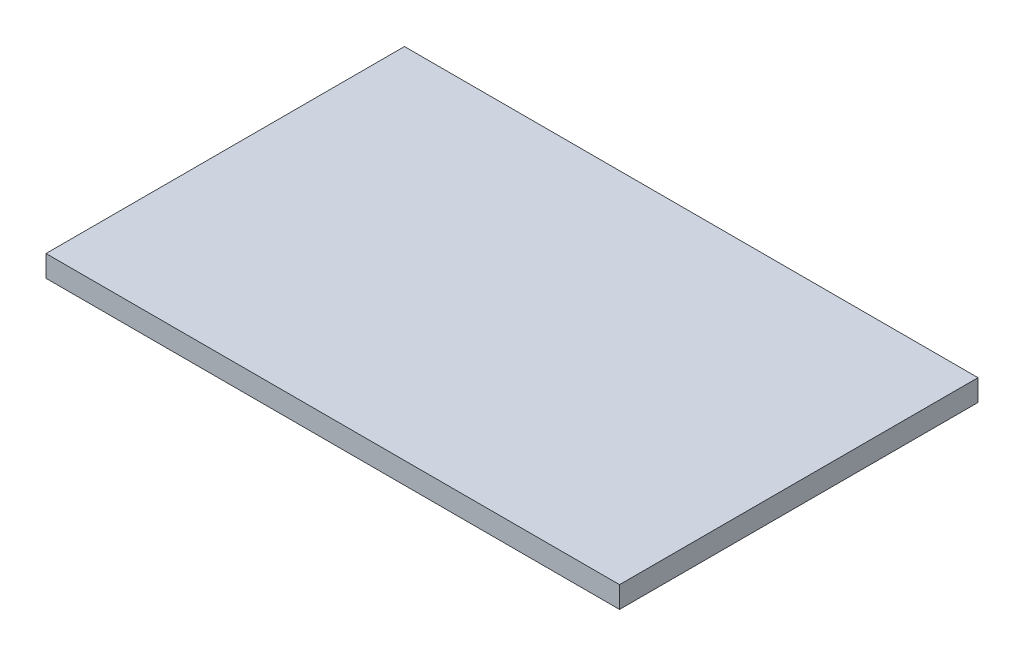
ISO-10303-21;
HEADER;
FILE_DESCRIPTION(('STEP AP214'),'2;1');
FILE_NAME('part.step','',(''),(''),'','','');
FILE_SCHEMA(('AUTOMOTIVE_DESIGN { 1 0 10303 214 1 1 1 1 }'));
ENDSEC;
DATA;
#1=APPLICATION_CONTEXT('core data for automotive mechanical design processes');
#2=APPLICATION_PROTOCOL_DEFINITION('international standard','automotive_design',2000,#1);
#3=PRODUCT_CONTEXT('',#1,'mechanical');
#4=PRODUCT('Part','Part','',(#3));
#5=PRODUCT_RELATED_PRODUCT_CATEGORY('part','',(#4));
#6=PRODUCT_DEFINITION_FORMATION('','',#4);
#7=PRODUCT_DEFINITION_CONTEXT('part definition',#1,'design');
#8=PRODUCT_DEFINITION('design','',#6,#7);
#9=PRODUCT_DEFINITION_SHAPE('','',#8);
#10=(LENGTH_UNIT() NAMED_UNIT(*) SI_UNIT(.MILLI.,.METRE.));
#11=(NAMED_UNIT(*) PLANE_ANGLE_UNIT() SI_UNIT($,.RADIAN.));
#12=(NAMED_UNIT(*) SI_UNIT($,.STERADIAN.) SOLID_ANGLE_UNIT());
#13=UNCERTAINTY_MEASURE_WITH_UNIT(LENGTH_MEASURE(1.E-05),#10,'distance_accuracy_value','');
#14=(GEOMETRIC_REPRESENTATION_CONTEXT(3) GLOBAL_UNCERTAINTY_ASSIGNED_CONTEXT((#13)) GLOBAL_UNIT_ASSIGNED_CONTEXT((#10,
#11,#12)) REPRESENTATION_CONTEXT('',''));
#15=CARTESIAN_POINT('',(0.,0.,0.));
#16=DIRECTION('',(0.,0.,1.));
#17=DIRECTION('',(1.,0.,0.));
#18=AXIS2_PLACEMENT_3D('',#15,#16,#17);
#19=CARTESIAN_POINT('',(-29.6660100231776,3.,-36.2639326273211));
#20=DIRECTION('',(1.,0.,0.));
#21=DIRECTION('',(0.,0.,-1.));
#22=AXIS2_PLACEMENT_3D('',#19,#20,#21);
#23=PLANE('',#22);
#24=DIRECTION('',(0.,0.,1.));
#25=VECTOR('',#24,1.);
#26=CARTESIAN_POINT('',(-29.6660100231776,0.,-36.2639326273211));
#27=LINE('',#26,#25);
#28=CARTESIAN_POINT('',(-29.6660100231776,0.,-36.2639326273211));
#29=VERTEX_POINT('',#28);
#30=CARTESIAN_POINT('',(-29.6660100231776,0.,13.7360673726789));
#31=VERTEX_POINT('',#30);
#32=EDGE_CURVE('E96',#29,#31,#27,.T.);
#33=ORIENTED_EDGE('',*,*,#32,.T.);
#34=DIRECTION('',(0.,-1.,0.));
#35=VECTOR('',#34,1.);
#36=CARTESIAN_POINT('',(-29.6660100231776,3.,13.7360673726789));
#37=LINE('',#36,#35);
#38=CARTESIAN_POINT('',(-29.6660100231776,3.,13.7360673726789));
#39=VERTEX_POINT('',#38);
#40=EDGE_CURVE('E11',#39,#31,#37,.T.);
#41=ORIENTED_EDGE('',*,*,#40,.F.);
#42=DIRECTION('',(0.,0.,1.));
#43=VECTOR('',#42,1.);
#44=CARTESIAN_POINT('',(-29.6660100231776,3.,-36.2639326273211));
#45=LINE('',#44,#43);
#46=CARTESIAN_POINT('',(-29.6660100231776,3.,-36.2639326273211));
#47=VERTEX_POINT('',#46);
#48=EDGE_CURVE('E84',#47,#39,#45,.T.);
#49=ORIENTED_EDGE('',*,*,#48,.F.);
#50=DIRECTION('',(0.,-1.,0.));
#51=VECTOR('',#50,1.);
#52=CARTESIAN_POINT('',(-29.6660100231776,3.,-36.2639326273211));
#53=LINE('',#52,#51);
#54=EDGE_CURVE('E92',#47,#29,#53,.T.);
#55=ORIENTED_EDGE('',*,*,#54,.T.);
#56=EDGE_LOOP('',(#33,#41,#49,#55));
#57=FACE_BOUND('',#56,.T.);
#58=ADVANCED_FACE('F33',(#57),#23,.F.);
#59=CARTESIAN_POINT('',(-29.6660100231776,3.,13.7360673726789));
#60=DIRECTION('',(0.,0.,-1.));
#61=DIRECTION('',(-1.,0.,0.));
#62=AXIS2_PLACEMENT_3D('',#59,#60,#61);
#63=PLANE('',#62);
#64=DIRECTION('',(1.,0.,0.));
#65=VECTOR('',#64,1.);
#66=CARTESIAN_POINT('',(-29.6660100231776,0.,13.7360673726789));
#67=LINE('',#66,#65);
#68=CARTESIAN_POINT('',(50.3339899768224,0.,13.7360673726789));
#69=VERTEX_POINT('',#68);
#70=EDGE_CURVE('E88',#31,#69,#67,.T.);
#71=ORIENTED_EDGE('',*,*,#70,.T.);
#72=DIRECTION('',(0.,-1.,0.));
#73=VECTOR('',#72,1.);
#74=CARTESIAN_POINT('',(50.3339899768224,3.,13.7360673726789));
#75=LINE('',#74,#73);
#76=CARTESIAN_POINT('',(50.3339899768224,3.,13.7360673726789));
#77=VERTEX_POINT('',#76);
#78=EDGE_CURVE('E41',#77,#69,#75,.T.);
#79=ORIENTED_EDGE('',*,*,#78,.F.);
#80=DIRECTION('',(1.,0.,0.));
#81=VECTOR('',#80,1.);
#82=CARTESIAN_POINT('',(-29.6660100231776,3.,13.7360673726789));
#83=LINE('',#82,#81);
#84=EDGE_CURVE('E79',#39,#77,#83,.T.);
#85=ORIENTED_EDGE('',*,*,#84,.F.);
#86=ORIENTED_EDGE('',*,*,#40,.T.);
#87=EDGE_LOOP('',(#71,#79,#85,#86));
#88=FACE_BOUND('',#87,.T.);
#89=ADVANCED_FACE('F87',(#88),#63,.F.);
#90=CARTESIAN_POINT('',(50.3339899768224,3.,-36.2639326273211));
#91=DIRECTION('',(-1.,0.,0.));
#92=DIRECTION('',(0.,0.,1.));
#93=AXIS2_PLACEMENT_3D('',#90,#91,#92);
#94=PLANE('',#93);
#95=DIRECTION('',(0.,0.,-1.));
#96=VECTOR('',#95,1.);
#97=CARTESIAN_POINT('',(50.3339899768224,0.,-36.2639326273211));
#98=LINE('',#97,#96);
#99=CARTESIAN_POINT('',(50.3339899768224,0.,-36.2639326273211));
#100=VERTEX_POINT('',#99);
#101=EDGE_CURVE('E66',#69,#100,#98,.T.);
#102=ORIENTED_EDGE('',*,*,#101,.T.);
#103=DIRECTION('',(0.,-1.,0.));
#104=VECTOR('',#103,1.);
#105=CARTESIAN_POINT('',(50.3339899768224,3.,-36.2639326273211));
#106=LINE('',#105,#104);
#107=CARTESIAN_POINT('',(50.3339899768224,3.,-36.2639326273211));
#108=VERTEX_POINT('',#107);
#109=EDGE_CURVE('E89',#108,#100,#106,.T.);
#110=ORIENTED_EDGE('',*,*,#109,.F.);
#111=DIRECTION('',(0.,0.,-1.));
#112=VECTOR('',#111,1.);
#113=CARTESIAN_POINT('',(50.3339899768224,3.,-36.2639326273211));
#114=LINE('',#113,#112);
#115=EDGE_CURVE('E82',#77,#108,#114,.T.);
#116=ORIENTED_EDGE('',*,*,#115,.F.);
#117=ORIENTED_EDGE('',*,*,#78,.T.);
#118=EDGE_LOOP('',(#102,#110,#116,#117));
#119=FACE_BOUND('',#118,.T.);
#120=ADVANCED_FACE('F90',(#119),#94,.F.);
#121=CARTESIAN_POINT('',(-29.6660100231776,3.,-36.2639326273211));
#122=DIRECTION('',(0.,0.,1.));
#123=DIRECTION('',(1.,0.,0.));
#124=AXIS2_PLACEMENT_3D('',#121,#122,#123);
#125=PLANE('',#124);
#126=DIRECTION('',(-1.,0.,0.));
#127=VECTOR('',#126,1.);
#128=CARTESIAN_POINT('',(-29.6660100231776,0.,-36.2639326273211));
#129=LINE('',#128,#127);
#130=EDGE_CURVE('E72',#100,#29,#129,.T.);
#131=ORIENTED_EDGE('',*,*,#130,.T.);
#132=ORIENTED_EDGE('',*,*,#54,.F.);
#133=DIRECTION('',(-1.,0.,0.));
#134=VECTOR('',#133,1.);
#135=CARTESIAN_POINT('',(-29.6660100231776,3.,-36.2639326273211));
#136=LINE('',#135,#134);
#137=EDGE_CURVE('E49',#108,#47,#136,.T.);
#138=ORIENTED_EDGE('',*,*,#137,.F.);
#139=ORIENTED_EDGE('',*,*,#109,.T.);
#140=EDGE_LOOP('',(#131,#132,#138,#139));
#141=FACE_BOUND('',#140,.T.);
#142=ADVANCED_FACE('F103',(#141),#125,.F.);
#143=CARTESIAN_POINT('',(0.,3.,0.));
#144=DIRECTION('',(0.,1.,0.));
#145=DIRECTION('',(0.,0.,1.));
#146=AXIS2_PLACEMENT_3D('',#143,#144,#145);
#147=PLANE('',#146);
#148=ORIENTED_EDGE('',*,*,#48,.T.);
#149=ORIENTED_EDGE('',*,*,#84,.T.);
#150=ORIENTED_EDGE('',*,*,#115,.T.);
#151=ORIENTED_EDGE('',*,*,#137,.T.);
#152=EDGE_LOOP('',(#148,#149,#150,#151));
#153=FACE_BOUND('',#152,.T.);
#154=ADVANCED_FACE('F80',(#153),#147,.T.);
#155=CARTESIAN_POINT('',(0.,0.,0.));
#156=DIRECTION('',(0.,1.,0.));
#157=DIRECTION('',(0.,0.,1.));
#158=AXIS2_PLACEMENT_3D('',#155,#156,#157);
#159=PLANE('',#158);
#160=ORIENTED_EDGE('',*,*,#32,.F.);
#161=ORIENTED_EDGE('',*,*,#130,.F.);
#162=ORIENTED_EDGE('',*,*,#101,.F.);
#163=ORIENTED_EDGE('',*,*,#70,.F.);
#164=EDGE_LOOP('',(#160,#161,#162,#163));
#165=FACE_BOUND('',#164,.T.);
#166=ADVANCED_FACE('F106',(#165),#159,.F.);
#167=CLOSED_SHELL('',(#58,#89,#120,#142,#154,#166));
#168=MANIFOLD_SOLID_BREP('B2',#167);
#169=ADVANCED_BREP_SHAPE_REPRESENTATION('',(#18,#168),#14);
#170=SHAPE_DEFINITION_REPRESENTATION(#9,#169);
ENDSEC;
END-ISO-10303-21;
